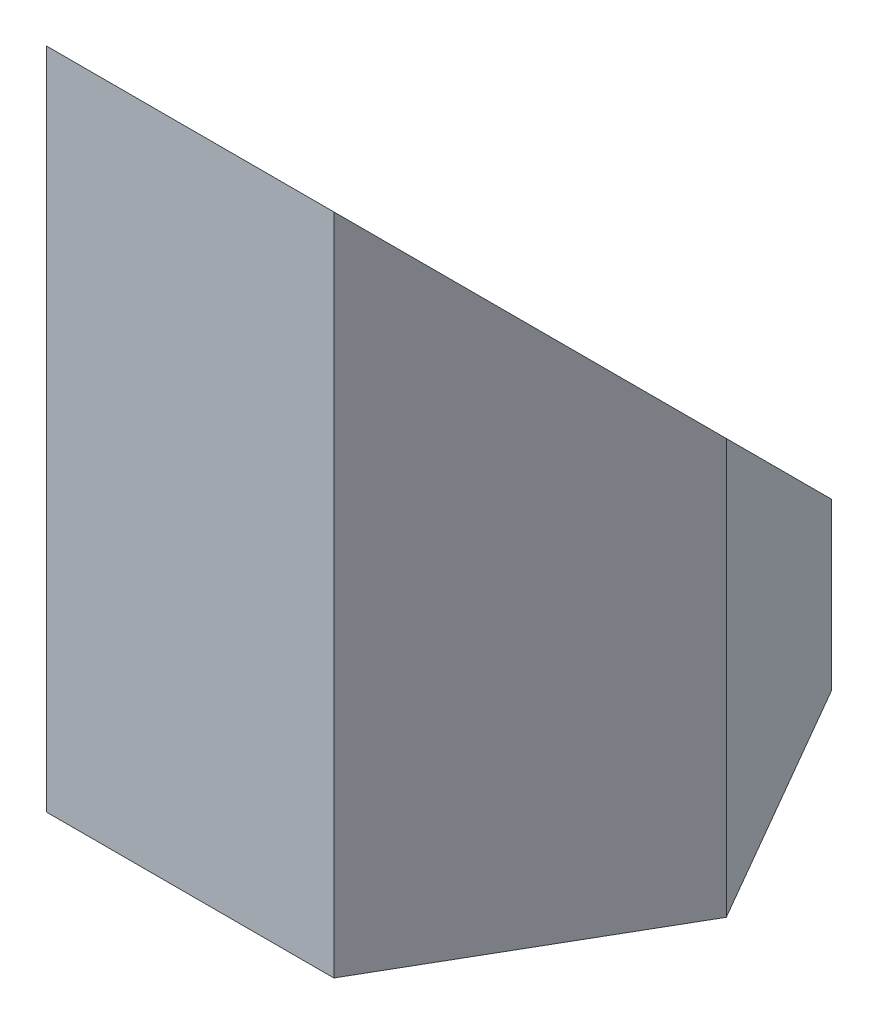
ISO-10303-21;
HEADER;
FILE_DESCRIPTION(('STEP AP214'),'2;1');
FILE_NAME('part.step','',(''),(''),'','','');
FILE_SCHEMA(('AUTOMOTIVE_DESIGN { 1 0 10303 214 1 1 1 1 }'));
ENDSEC;
DATA;
#1=APPLICATION_CONTEXT('core data for automotive mechanical design processes');
#2=APPLICATION_PROTOCOL_DEFINITION('international standard','automotive_design',2000,#1);
#3=PRODUCT_CONTEXT('',#1,'mechanical');
#4=PRODUCT('Part','Part','',(#3));
#5=PRODUCT_RELATED_PRODUCT_CATEGORY('part','',(#4));
#6=PRODUCT_DEFINITION_FORMATION('','',#4);
#7=PRODUCT_DEFINITION_CONTEXT('part definition',#1,'design');
#8=PRODUCT_DEFINITION('design','',#6,#7);
#9=PRODUCT_DEFINITION_SHAPE('','',#8);
#10=(LENGTH_UNIT() NAMED_UNIT(*) SI_UNIT(.MILLI.,.METRE.));
#11=(NAMED_UNIT(*) PLANE_ANGLE_UNIT() SI_UNIT($,.RADIAN.));
#12=(NAMED_UNIT(*) SI_UNIT($,.STERADIAN.) SOLID_ANGLE_UNIT());
#13=UNCERTAINTY_MEASURE_WITH_UNIT(LENGTH_MEASURE(1.E-05),#10,'distance_accuracy_value','');
#14=(GEOMETRIC_REPRESENTATION_CONTEXT(3) GLOBAL_UNCERTAINTY_ASSIGNED_CONTEXT((#13)) GLOBAL_UNIT_ASSIGNED_CONTEXT((#10,
#11,#12)) REPRESENTATION_CONTEXT('',''));
#15=CARTESIAN_POINT('',(0.,0.,0.));
#16=DIRECTION('',(0.,0.,1.));
#17=DIRECTION('',(1.,0.,0.));
#18=AXIS2_PLACEMENT_3D('',#15,#16,#17);
#19=CARTESIAN_POINT('',(-69.2820323027551,80.,60.));
#20=DIRECTION('',(0.,0.,-1.));
#21=DIRECTION('',(-1.,0.,0.));
#22=AXIS2_PLACEMENT_3D('',#19,#20,#21);
#23=PLANE('',#22);
#24=DIRECTION('',(0.,-1.,0.));
#25=VECTOR('',#24,1.);
#26=CARTESIAN_POINT('',(-17.3205080756888,80.,60.));
#27=LINE('',#26,#25);
#28=CARTESIAN_POINT('',(-17.3205080756888,80.,60.));
#29=VERTEX_POINT('',#28);
#30=CARTESIAN_POINT('',(-17.3205080756888,0.,60.));
#31=VERTEX_POINT('',#30);
#32=EDGE_CURVE('E102',#29,#31,#27,.T.);
#33=ORIENTED_EDGE('',*,*,#32,.F.);
#34=DIRECTION('',(1.,0.,0.));
#35=VECTOR('',#34,1.);
#36=CARTESIAN_POINT('',(-69.2820323027551,80.,60.));
#37=LINE('',#36,#35);
#38=CARTESIAN_POINT('',(-51.9615242270664,80.,60.));
#39=VERTEX_POINT('',#38);
#40=EDGE_CURVE('E106',#39,#29,#37,.T.);
#41=ORIENTED_EDGE('',*,*,#40,.F.);
#42=DIRECTION('',(0.,-1.,0.));
#43=VECTOR('',#42,1.);
#44=CARTESIAN_POINT('',(-51.9615242270664,80.,60.));
#45=LINE('',#44,#43);
#46=CARTESIAN_POINT('',(-51.9615242270664,0.,60.));
#47=VERTEX_POINT('',#46);
#48=EDGE_CURVE('E54',#39,#47,#45,.T.);
#49=ORIENTED_EDGE('',*,*,#48,.T.);
#50=DIRECTION('',(1.,0.,0.));
#51=VECTOR('',#50,1.);
#52=CARTESIAN_POINT('',(-69.2820323027551,0.,60.));
#53=LINE('',#52,#51);
#54=EDGE_CURVE('E107',#47,#31,#53,.T.);
#55=ORIENTED_EDGE('',*,*,#54,.T.);
#56=EDGE_LOOP('',(#33,#41,#49,#55));
#57=FACE_BOUND('',#56,.T.);
#58=ADVANCED_FACE('F33',(#57),#23,.F.);
#59=CARTESIAN_POINT('',(-69.2820323027551,80.,0.));
#60=DIRECTION('',(0.,0.,1.));
#61=DIRECTION('',(1.,0.,0.));
#62=AXIS2_PLACEMENT_3D('',#59,#60,#61);
#63=PLANE('',#62);
#64=DIRECTION('',(0.,-1.,0.));
#65=VECTOR('',#64,1.);
#66=CARTESIAN_POINT('',(-51.9615242270664,80.,0.));
#67=LINE('',#66,#65);
#68=CARTESIAN_POINT('',(-51.9615242270664,19.9999999999998,0.));
#69=VERTEX_POINT('',#68);
#70=CARTESIAN_POINT('',(-51.9615242270664,0.,0.));
#71=VERTEX_POINT('',#70);
#72=EDGE_CURVE('E85',#69,#71,#67,.T.);
#73=ORIENTED_EDGE('',*,*,#72,.F.);
#74=DIRECTION('',(1.,0.,0.));
#75=VECTOR('',#74,1.);
#76=CARTESIAN_POINT('',(-80.,19.9999999999998,0.));
#77=LINE('',#76,#75);
#78=CARTESIAN_POINT('',(-17.3205080756888,19.9999999999998,0.));
#79=VERTEX_POINT('',#78);
#80=EDGE_CURVE('E47',#69,#79,#77,.T.);
#81=ORIENTED_EDGE('',*,*,#80,.T.);
#82=DIRECTION('',(0.,-1.,0.));
#83=VECTOR('',#82,1.);
#84=CARTESIAN_POINT('',(-17.3205080756888,80.,0.));
#85=LINE('',#84,#83);
#86=CARTESIAN_POINT('',(-17.3205080756888,0.,0.));
#87=VERTEX_POINT('',#86);
#88=EDGE_CURVE('E105',#79,#87,#85,.T.);
#89=ORIENTED_EDGE('',*,*,#88,.T.);
#90=DIRECTION('',(-1.,0.,0.));
#91=VECTOR('',#90,1.);
#92=CARTESIAN_POINT('',(-69.2820323027551,0.,0.));
#93=LINE('',#92,#91);
#94=EDGE_CURVE('E99',#87,#71,#93,.T.);
#95=ORIENTED_EDGE('',*,*,#94,.T.);
#96=EDGE_LOOP('',(#73,#81,#89,#95));
#97=FACE_BOUND('',#96,.T.);
#98=ADVANCED_FACE('F104',(#97),#63,.F.);
#99=CARTESIAN_POINT('',(0.,0.,0.));
#100=DIRECTION('',(0.,1.,0.));
#101=DIRECTION('',(0.,0.,1.));
#102=AXIS2_PLACEMENT_3D('',#99,#100,#101);
#103=PLANE('',#102);
#104=CARTESIAN_POINT('',(-34.6410161513776,0.,30.));
#105=DIRECTION('',(0.,-1.,0.));
#106=DIRECTION('',(0.,0.,-1.));
#107=AXIS2_PLACEMENT_3D('',#104,#105,#106);
#108=CIRCLE('',#107,12.);
#109=CARTESIAN_POINT('',(-34.6410161513776,0.,18.));
#110=VERTEX_POINT('',#109);
#111=EDGE_CURVE('E130',#110,#110,#108,.T.);
#112=ORIENTED_EDGE('',*,*,#111,.F.);
#113=EDGE_LOOP('',(#112));
#114=FACE_BOUND('',#113,.T.);
#115=DIRECTION('',(0.5,0.,-0.866025403784439));
#116=VECTOR('',#115,1.);
#117=CARTESIAN_POINT('',(-38.9711431702998,0.,-22.5));
#118=LINE('',#117,#116);
#119=CARTESIAN_POINT('',(-69.2820323027551,0.,30.));
#120=VERTEX_POINT('',#119);
#121=EDGE_CURVE('E88',#120,#71,#118,.T.);
#122=ORIENTED_EDGE('',*,*,#121,.T.);
#123=ORIENTED_EDGE('',*,*,#94,.F.);
#124=DIRECTION('',(0.5,0.,0.866025403784439));
#125=VECTOR('',#124,1.);
#126=CARTESIAN_POINT('',(-12.9903810567666,0.,7.49999999999999));
#127=LINE('',#126,#125);
#128=CARTESIAN_POINT('',(0.,0.,30.));
#129=VERTEX_POINT('',#128);
#130=EDGE_CURVE('E133',#87,#129,#127,.T.);
#131=ORIENTED_EDGE('',*,*,#130,.T.);
#132=DIRECTION('',(-0.5,0.,0.866025403784439));
#133=VECTOR('',#132,1.);
#134=CARTESIAN_POINT('',(12.9903810567666,0.,7.50000000000001));
#135=LINE('',#134,#133);
#136=EDGE_CURVE('E145',#129,#31,#135,.T.);
#137=ORIENTED_EDGE('',*,*,#136,.T.);
#138=ORIENTED_EDGE('',*,*,#54,.F.);
#139=DIRECTION('',(-0.5,0.,-0.866025403784439));
#140=VECTOR('',#139,1.);
#141=CARTESIAN_POINT('',(-64.9519052838329,0.,37.5));
#142=LINE('',#141,#140);
#143=EDGE_CURVE('E101',#47,#120,#142,.T.);
#144=ORIENTED_EDGE('',*,*,#143,.T.);
#145=EDGE_LOOP('',(#122,#123,#131,#137,#138,#144));
#146=FACE_BOUND('',#145,.T.);
#147=ADVANCED_FACE('F97',(#114,#146),#103,.F.);
#148=CARTESIAN_POINT('',(-80.,80.,60.));
#149=DIRECTION('',(0.,-0.707106781186546,0.707106781186549));
#150=DIRECTION('',(0.,-0.707106781186549,-0.707106781186546));
#151=AXIS2_PLACEMENT_3D('',#148,#149,#150);
#152=PLANE('',#151);
#153=CARTESIAN_POINT('',(-34.6410161513776,49.9999999999999,30.));
#154=DIRECTION('',(0.,-0.707106781186546,0.707106781186549));
#155=DIRECTION('',(0.,-0.707106781186549,-0.707106781186546));
#156=AXIS2_PLACEMENT_3D('',#153,#154,#155);
#157=ELLIPSE('',#156,16.9705627484772,12.);
#158=CARTESIAN_POINT('',(-34.6410161513776,37.9999999999998,18.));
#159=VERTEX_POINT('',#158);
#160=EDGE_CURVE('E114',#159,#159,#157,.T.);
#161=ORIENTED_EDGE('',*,*,#160,.T.);
#162=EDGE_LOOP('',(#161));
#163=FACE_BOUND('',#162,.T.);
#164=DIRECTION('',(0.377964473009227,-0.654653670707978,-0.654653670707976));
#165=VECTOR('',#164,1.);
#166=CARTESIAN_POINT('',(-85.6593203243805,78.3662949436443,58.3662949436443));
#167=LINE('',#166,#165);
#168=CARTESIAN_POINT('',(-69.2820323027551,50.,30.));
#169=VERTEX_POINT('',#168);
#170=EDGE_CURVE('E91',#169,#69,#167,.T.);
#171=ORIENTED_EDGE('',*,*,#170,.F.);
#172=DIRECTION('',(-0.377964473009227,-0.654653670707978,-0.654653670707976));
#173=VECTOR('',#172,1.);
#174=CARTESIAN_POINT('',(-55.9670207660569,73.0622764849271,53.0622764849272));
#175=LINE('',#174,#173);
#176=EDGE_CURVE('E11',#39,#169,#175,.T.);
#177=ORIENTED_EDGE('',*,*,#176,.F.);
#178=ORIENTED_EDGE('',*,*,#40,.T.);
#179=DIRECTION('',(-0.377964473009227,0.654653670707978,0.654653670707976));
#180=VECTOR('',#179,1.);
#181=CARTESIAN_POINT('',(-26.2747212077332,95.5091520865015,75.5091520865014));
#182=LINE('',#181,#180);
#183=CARTESIAN_POINT('',(0.,49.9999999999999,30.));
#184=VERTEX_POINT('',#183);
#185=EDGE_CURVE('E126',#184,#29,#182,.T.);
#186=ORIENTED_EDGE('',*,*,#185,.F.);
#187=DIRECTION('',(0.377964473009226,0.654653670707978,0.654653670707976));
#188=VECTOR('',#187,1.);
#189=CARTESIAN_POINT('',(3.41757835059044,55.91941934207,35.9194193420701));
#190=LINE('',#189,#188);
#191=EDGE_CURVE('E40',#79,#184,#190,.T.);
#192=ORIENTED_EDGE('',*,*,#191,.F.);
#193=ORIENTED_EDGE('',*,*,#80,.F.);
#194=EDGE_LOOP('',(#171,#177,#178,#186,#192,#193));
#195=FACE_BOUND('',#194,.T.);
#196=ADVANCED_FACE('F125',(#163,#195),#152,.F.);
#197=CARTESIAN_POINT('',(-34.6410161513776,80.,30.));
#198=DIRECTION('',(0.,-1.,0.));
#199=DIRECTION('',(0.,0.,-1.));
#200=AXIS2_PLACEMENT_3D('',#197,#198,#199);
#201=CYLINDRICAL_SURFACE('',#200,12.);
#202=ORIENTED_EDGE('',*,*,#111,.T.);
#203=EDGE_LOOP('',(#202));
#204=FACE_BOUND('',#203,.T.);
#205=ORIENTED_EDGE('',*,*,#160,.F.);
#206=EDGE_LOOP('',(#205));
#207=FACE_BOUND('',#206,.T.);
#208=ADVANCED_FACE('F169',(#204,#207),#201,.F.);
#209=CARTESIAN_POINT('',(-12.9903810567666,80.,7.49999999999999));
#210=DIRECTION('',(0.866025403784439,0.,-0.5));
#211=DIRECTION('',(-0.5,0.,-0.866025403784439));
#212=AXIS2_PLACEMENT_3D('',#209,#210,#211);
#213=PLANE('',#212);
#214=ORIENTED_EDGE('',*,*,#191,.T.);
#215=DIRECTION('',(0.,-1.,0.));
#216=VECTOR('',#215,1.);
#217=CARTESIAN_POINT('',(0.,80.,30.));
#218=LINE('',#217,#216);
#219=EDGE_CURVE('E122',#184,#129,#218,.T.);
#220=ORIENTED_EDGE('',*,*,#219,.T.);
#221=ORIENTED_EDGE('',*,*,#130,.F.);
#222=ORIENTED_EDGE('',*,*,#88,.F.);
#223=EDGE_LOOP('',(#214,#220,#221,#222));
#224=FACE_BOUND('',#223,.T.);
#225=ADVANCED_FACE('F121',(#224),#213,.T.);
#226=CARTESIAN_POINT('',(-64.9519052838329,80.,37.5));
#227=DIRECTION('',(-0.866025403784439,0.,0.5));
#228=DIRECTION('',(0.5,0.,0.866025403784439));
#229=AXIS2_PLACEMENT_3D('',#226,#227,#228);
#230=PLANE('',#229);
#231=ORIENTED_EDGE('',*,*,#176,.T.);
#232=DIRECTION('',(0.,-1.,0.));
#233=VECTOR('',#232,1.);
#234=CARTESIAN_POINT('',(-69.2820323027551,80.,30.));
#235=LINE('',#234,#233);
#236=EDGE_CURVE('E116',#169,#120,#235,.T.);
#237=ORIENTED_EDGE('',*,*,#236,.T.);
#238=ORIENTED_EDGE('',*,*,#143,.F.);
#239=ORIENTED_EDGE('',*,*,#48,.F.);
#240=EDGE_LOOP('',(#231,#237,#238,#239));
#241=FACE_BOUND('',#240,.T.);
#242=ADVANCED_FACE('F154',(#241),#230,.T.);
#243=CARTESIAN_POINT('',(-38.9711431702998,80.,-22.5));
#244=DIRECTION('',(-0.866025403784439,0.,-0.5));
#245=DIRECTION('',(-0.5,0.,0.866025403784439));
#246=AXIS2_PLACEMENT_3D('',#243,#244,#245);
#247=PLANE('',#246);
#248=ORIENTED_EDGE('',*,*,#170,.T.);
#249=ORIENTED_EDGE('',*,*,#72,.T.);
#250=ORIENTED_EDGE('',*,*,#121,.F.);
#251=ORIENTED_EDGE('',*,*,#236,.F.);
#252=EDGE_LOOP('',(#248,#249,#250,#251));
#253=FACE_BOUND('',#252,.T.);
#254=ADVANCED_FACE('F87',(#253),#247,.T.);
#255=CARTESIAN_POINT('',(12.9903810567666,80.,7.50000000000001));
#256=DIRECTION('',(0.866025403784438,0.,0.5));
#257=DIRECTION('',(0.5,0.,-0.866025403784439));
#258=AXIS2_PLACEMENT_3D('',#255,#256,#257);
#259=PLANE('',#258);
#260=ORIENTED_EDGE('',*,*,#185,.T.);
#261=ORIENTED_EDGE('',*,*,#32,.T.);
#262=ORIENTED_EDGE('',*,*,#136,.F.);
#263=ORIENTED_EDGE('',*,*,#219,.F.);
#264=EDGE_LOOP('',(#260,#261,#262,#263));
#265=FACE_BOUND('',#264,.T.);
#266=ADVANCED_FACE('F148',(#265),#259,.T.);
#267=CLOSED_SHELL('',(#58,#98,#147,#196,#208,#225,#242,#254,#266));
#268=MANIFOLD_SOLID_BREP('B2',#267);
#269=ADVANCED_BREP_SHAPE_REPRESENTATION('',(#18,#268),#14);
#270=SHAPE_DEFINITION_REPRESENTATION(#9,#269);
ENDSEC;
END-ISO-10303-21;
